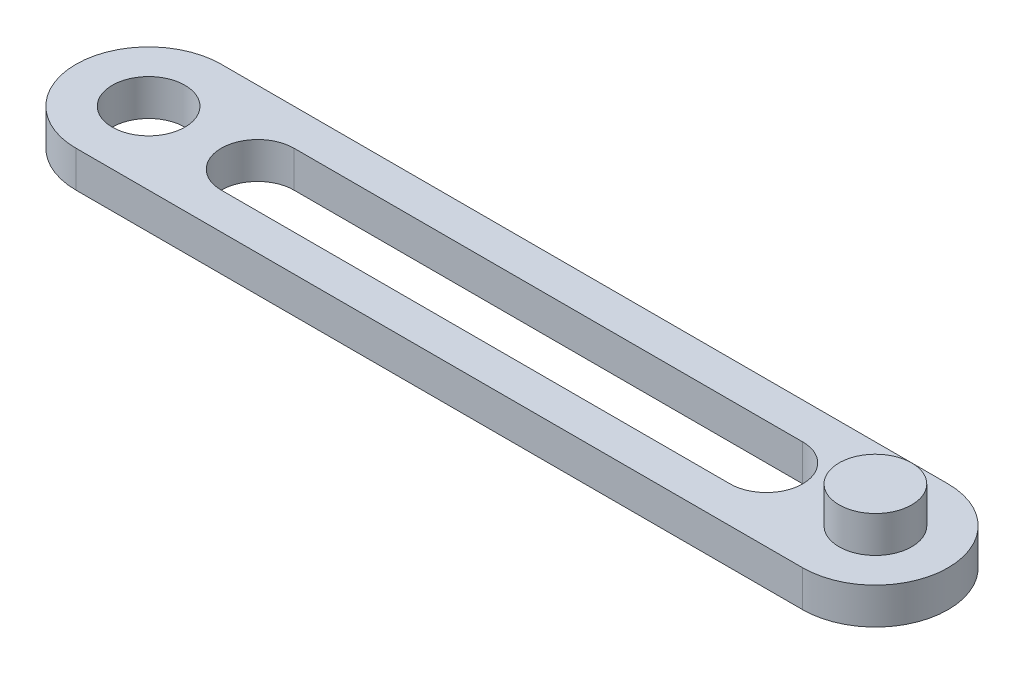
ISO-10303-21;
HEADER;
FILE_DESCRIPTION(('STEP AP214'),'2;1');
FILE_NAME('part.step','',(''),(''),'','','');
FILE_SCHEMA(('AUTOMOTIVE_DESIGN { 1 0 10303 214 1 1 1 1 }'));
ENDSEC;
DATA;
#1=APPLICATION_CONTEXT('core data for automotive mechanical design processes');
#2=APPLICATION_PROTOCOL_DEFINITION('international standard','automotive_design',2000,#1);
#3=PRODUCT_CONTEXT('',#1,'mechanical');
#4=PRODUCT('Part','Part','',(#3));
#5=PRODUCT_RELATED_PRODUCT_CATEGORY('part','',(#4));
#6=PRODUCT_DEFINITION_FORMATION('','',#4);
#7=PRODUCT_DEFINITION_CONTEXT('part definition',#1,'design');
#8=PRODUCT_DEFINITION('design','',#6,#7);
#9=PRODUCT_DEFINITION_SHAPE('','',#8);
#10=(LENGTH_UNIT() NAMED_UNIT(*) SI_UNIT(.MILLI.,.METRE.));
#11=(NAMED_UNIT(*) PLANE_ANGLE_UNIT() SI_UNIT($,.RADIAN.));
#12=(NAMED_UNIT(*) SI_UNIT($,.STERADIAN.) SOLID_ANGLE_UNIT());
#13=UNCERTAINTY_MEASURE_WITH_UNIT(LENGTH_MEASURE(1.E-05),#10,'distance_accuracy_value','');
#14=(GEOMETRIC_REPRESENTATION_CONTEXT(3) GLOBAL_UNCERTAINTY_ASSIGNED_CONTEXT((#13)) GLOBAL_UNIT_ASSIGNED_CONTEXT((#10,
#11,#12)) REPRESENTATION_CONTEXT('',''));
#15=CARTESIAN_POINT('',(0.,0.,0.));
#16=DIRECTION('',(0.,0.,1.));
#17=DIRECTION('',(1.,0.,0.));
#18=AXIS2_PLACEMENT_3D('',#15,#16,#17);
#19=CARTESIAN_POINT('',(-50.,5.,0.));
#20=DIRECTION('',(0.,-1.,0.));
#21=DIRECTION('',(0.,0.,-1.));
#22=AXIS2_PLACEMENT_3D('',#19,#20,#21);
#23=CYLINDRICAL_SURFACE('',#22,10.);
#24=CARTESIAN_POINT('',(-50.,0.,0.));
#25=DIRECTION('',(0.,1.,0.));
#26=DIRECTION('',(0.,0.,1.));
#27=AXIS2_PLACEMENT_3D('',#24,#25,#26);
#28=CIRCLE('',#27,10.);
#29=CARTESIAN_POINT('',(-50.,0.,-9.99999999999999));
#30=VERTEX_POINT('',#29);
#31=CARTESIAN_POINT('',(-50.,0.,10.));
#32=VERTEX_POINT('',#31);
#33=EDGE_CURVE('E140',#30,#32,#28,.T.);
#34=ORIENTED_EDGE('',*,*,#33,.T.);
#35=DIRECTION('',(0.,-1.,0.));
#36=VECTOR('',#35,1.);
#37=CARTESIAN_POINT('',(-50.,5.,10.));
#38=LINE('',#37,#36);
#39=CARTESIAN_POINT('',(-50.,5.,10.));
#40=VERTEX_POINT('',#39);
#41=EDGE_CURVE('E11',#40,#32,#38,.T.);
#42=ORIENTED_EDGE('',*,*,#41,.F.);
#43=CARTESIAN_POINT('',(-50.,5.,0.));
#44=DIRECTION('',(0.,1.,0.));
#45=DIRECTION('',(0.,0.,1.));
#46=AXIS2_PLACEMENT_3D('',#43,#44,#45);
#47=CIRCLE('',#46,10.);
#48=CARTESIAN_POINT('',(-50.,5.,-9.99999999999999));
#49=VERTEX_POINT('',#48);
#50=EDGE_CURVE('E144',#49,#40,#47,.T.);
#51=ORIENTED_EDGE('',*,*,#50,.F.);
#52=DIRECTION('',(0.,-1.,0.));
#53=VECTOR('',#52,1.);
#54=CARTESIAN_POINT('',(-50.,5.,-9.99999999999999));
#55=LINE('',#54,#53);
#56=EDGE_CURVE('E154',#49,#30,#55,.T.);
#57=ORIENTED_EDGE('',*,*,#56,.T.);
#58=EDGE_LOOP('',(#34,#42,#51,#57));
#59=FACE_BOUND('',#58,.T.);
#60=ADVANCED_FACE('F39',(#59),#23,.T.);
#61=CARTESIAN_POINT('',(-50.,5.,10.));
#62=DIRECTION('',(0.,0.,-1.));
#63=DIRECTION('',(-1.,0.,0.));
#64=AXIS2_PLACEMENT_3D('',#61,#62,#63);
#65=PLANE('',#64);
#66=DIRECTION('',(1.,0.,0.));
#67=VECTOR('',#66,1.);
#68=CARTESIAN_POINT('',(-50.,0.,10.));
#69=LINE('',#68,#67);
#70=CARTESIAN_POINT('',(50.,0.,10.));
#71=VERTEX_POINT('',#70);
#72=EDGE_CURVE('E157',#32,#71,#69,.T.);
#73=ORIENTED_EDGE('',*,*,#72,.T.);
#74=DIRECTION('',(0.,-1.,0.));
#75=VECTOR('',#74,1.);
#76=CARTESIAN_POINT('',(50.,5.,10.));
#77=LINE('',#76,#75);
#78=CARTESIAN_POINT('',(50.,5.,10.));
#79=VERTEX_POINT('',#78);
#80=EDGE_CURVE('E46',#79,#71,#77,.T.);
#81=ORIENTED_EDGE('',*,*,#80,.F.);
#82=DIRECTION('',(1.,0.,0.));
#83=VECTOR('',#82,1.);
#84=CARTESIAN_POINT('',(-50.,5.,10.));
#85=LINE('',#84,#83);
#86=EDGE_CURVE('E147',#40,#79,#85,.T.);
#87=ORIENTED_EDGE('',*,*,#86,.F.);
#88=ORIENTED_EDGE('',*,*,#41,.T.);
#89=EDGE_LOOP('',(#73,#81,#87,#88));
#90=FACE_BOUND('',#89,.T.);
#91=ADVANCED_FACE('F185',(#90),#65,.F.);
#92=CARTESIAN_POINT('',(50.,5.,0.));
#93=DIRECTION('',(0.,-1.,0.));
#94=DIRECTION('',(0.,0.,-1.));
#95=AXIS2_PLACEMENT_3D('',#92,#93,#94);
#96=CYLINDRICAL_SURFACE('',#95,10.);
#97=CARTESIAN_POINT('',(50.,0.,0.));
#98=DIRECTION('',(0.,1.,0.));
#99=DIRECTION('',(0.,0.,1.));
#100=AXIS2_PLACEMENT_3D('',#97,#98,#99);
#101=CIRCLE('',#100,10.);
#102=CARTESIAN_POINT('',(50.,0.,-10.));
#103=VERTEX_POINT('',#102);
#104=EDGE_CURVE('E159',#71,#103,#101,.T.);
#105=ORIENTED_EDGE('',*,*,#104,.T.);
#106=DIRECTION('',(0.,-1.,0.));
#107=VECTOR('',#106,1.);
#108=CARTESIAN_POINT('',(50.,5.,-10.));
#109=LINE('',#108,#107);
#110=CARTESIAN_POINT('',(50.,5.,-10.));
#111=VERTEX_POINT('',#110);
#112=EDGE_CURVE('E164',#111,#103,#109,.T.);
#113=ORIENTED_EDGE('',*,*,#112,.F.);
#114=CARTESIAN_POINT('',(50.,5.,0.));
#115=DIRECTION('',(0.,1.,0.));
#116=DIRECTION('',(0.,0.,1.));
#117=AXIS2_PLACEMENT_3D('',#114,#115,#116);
#118=CIRCLE('',#117,10.);
#119=EDGE_CURVE('E150',#79,#111,#118,.T.);
#120=ORIENTED_EDGE('',*,*,#119,.F.);
#121=ORIENTED_EDGE('',*,*,#80,.T.);
#122=EDGE_LOOP('',(#105,#113,#120,#121));
#123=FACE_BOUND('',#122,.T.);
#124=ADVANCED_FACE('F171',(#123),#96,.T.);
#125=CARTESIAN_POINT('',(-50.,5.,-9.99999999999999));
#126=DIRECTION('',(0.,0.,1.));
#127=DIRECTION('',(1.,0.,0.));
#128=AXIS2_PLACEMENT_3D('',#125,#126,#127);
#129=PLANE('',#128);
#130=DIRECTION('',(-1.,0.,0.));
#131=VECTOR('',#130,1.);
#132=CARTESIAN_POINT('',(-50.,0.,-9.99999999999999));
#133=LINE('',#132,#131);
#134=EDGE_CURVE('E148',#103,#30,#133,.T.);
#135=ORIENTED_EDGE('',*,*,#134,.T.);
#136=ORIENTED_EDGE('',*,*,#56,.F.);
#137=DIRECTION('',(-1.,0.,0.));
#138=VECTOR('',#137,1.);
#139=CARTESIAN_POINT('',(-50.,5.,-9.99999999999999));
#140=LINE('',#139,#138);
#141=EDGE_CURVE('E152',#111,#49,#140,.T.);
#142=ORIENTED_EDGE('',*,*,#141,.F.);
#143=ORIENTED_EDGE('',*,*,#112,.T.);
#144=EDGE_LOOP('',(#135,#136,#142,#143));
#145=FACE_BOUND('',#144,.T.);
#146=ADVANCED_FACE('F178',(#145),#129,.F.);
#147=CARTESIAN_POINT('',(-50.,5.,0.));
#148=DIRECTION('',(0.,1.,0.));
#149=DIRECTION('',(0.,0.,1.));
#150=AXIS2_PLACEMENT_3D('',#147,#148,#149);
#151=PLANE('',#150);
#152=CARTESIAN_POINT('',(-50.,5.,0.));
#153=DIRECTION('',(0.,1.,0.));
#154=DIRECTION('',(0.,0.,1.));
#155=AXIS2_PLACEMENT_3D('',#152,#153,#154);
#156=CIRCLE('',#155,5.);
#157=CARTESIAN_POINT('',(-50.,5.,5.));
#158=VERTEX_POINT('',#157);
#159=EDGE_CURVE('E231',#158,#158,#156,.T.);
#160=ORIENTED_EDGE('',*,*,#159,.F.);
#161=EDGE_LOOP('',(#160));
#162=FACE_BOUND('',#161,.T.);
#163=CARTESIAN_POINT('',(50.,5.,0.));
#164=DIRECTION('',(0.,1.,0.));
#165=DIRECTION('',(0.,0.,1.));
#166=AXIS2_PLACEMENT_3D('',#163,#164,#165);
#167=CIRCLE('',#166,5.);
#168=CARTESIAN_POINT('',(50.,5.,5.));
#169=VERTEX_POINT('',#168);
#170=EDGE_CURVE('E127',#169,#169,#167,.T.);
#171=ORIENTED_EDGE('',*,*,#170,.F.);
#172=EDGE_LOOP('',(#171));
#173=FACE_BOUND('',#172,.T.);
#174=CARTESIAN_POINT('',(-35.,5.,0.));
#175=DIRECTION('',(0.,1.,0.));
#176=DIRECTION('',(0.,0.,1.));
#177=AXIS2_PLACEMENT_3D('',#174,#175,#176);
#178=CIRCLE('',#177,5.);
#179=CARTESIAN_POINT('',(-35.,5.,-5.));
#180=VERTEX_POINT('',#179);
#181=CARTESIAN_POINT('',(-35.,5.,5.));
#182=VERTEX_POINT('',#181);
#183=EDGE_CURVE('E53',#180,#182,#178,.T.);
#184=ORIENTED_EDGE('',*,*,#183,.F.);
#185=DIRECTION('',(-1.,0.,0.));
#186=VECTOR('',#185,1.);
#187=CARTESIAN_POINT('',(-35.,5.,-5.));
#188=LINE('',#187,#186);
#189=CARTESIAN_POINT('',(35.,5.,-5.));
#190=VERTEX_POINT('',#189);
#191=EDGE_CURVE('E121',#190,#180,#188,.T.);
#192=ORIENTED_EDGE('',*,*,#191,.F.);
#193=CARTESIAN_POINT('',(35.,5.,0.));
#194=DIRECTION('',(0.,1.,0.));
#195=DIRECTION('',(0.,0.,1.));
#196=AXIS2_PLACEMENT_3D('',#193,#194,#195);
#197=CIRCLE('',#196,5.);
#198=CARTESIAN_POINT('',(35.,5.,5.));
#199=VERTEX_POINT('',#198);
#200=EDGE_CURVE('E124',#199,#190,#197,.T.);
#201=ORIENTED_EDGE('',*,*,#200,.F.);
#202=DIRECTION('',(1.,0.,0.));
#203=VECTOR('',#202,1.);
#204=CARTESIAN_POINT('',(-35.,5.,5.));
#205=LINE('',#204,#203);
#206=EDGE_CURVE('E133',#182,#199,#205,.T.);
#207=ORIENTED_EDGE('',*,*,#206,.F.);
#208=EDGE_LOOP('',(#184,#192,#201,#207));
#209=FACE_BOUND('',#208,.T.);
#210=ORIENTED_EDGE('',*,*,#50,.T.);
#211=ORIENTED_EDGE('',*,*,#86,.T.);
#212=ORIENTED_EDGE('',*,*,#119,.T.);
#213=ORIENTED_EDGE('',*,*,#141,.T.);
#214=EDGE_LOOP('',(#210,#211,#212,#213));
#215=FACE_BOUND('',#214,.T.);
#216=ADVANCED_FACE('F184',(#162,#173,#209,#215),#151,.T.);
#217=CARTESIAN_POINT('',(-50.,0.,0.));
#218=DIRECTION('',(0.,1.,0.));
#219=DIRECTION('',(0.,0.,1.));
#220=AXIS2_PLACEMENT_3D('',#217,#218,#219);
#221=PLANE('',#220);
#222=CARTESIAN_POINT('',(-50.,0.,0.));
#223=DIRECTION('',(0.,1.,0.));
#224=DIRECTION('',(0.,0.,1.));
#225=AXIS2_PLACEMENT_3D('',#222,#223,#224);
#226=CIRCLE('',#225,5.);
#227=CARTESIAN_POINT('',(-50.,0.,5.));
#228=VERTEX_POINT('',#227);
#229=EDGE_CURVE('E228',#228,#228,#226,.T.);
#230=ORIENTED_EDGE('',*,*,#229,.T.);
#231=EDGE_LOOP('',(#230));
#232=FACE_BOUND('',#231,.T.);
#233=DIRECTION('',(-1.,0.,0.));
#234=VECTOR('',#233,1.);
#235=CARTESIAN_POINT('',(-35.,0.,-5.));
#236=LINE('',#235,#234);
#237=CARTESIAN_POINT('',(35.,0.,-5.));
#238=VERTEX_POINT('',#237);
#239=CARTESIAN_POINT('',(-35.,0.,-5.));
#240=VERTEX_POINT('',#239);
#241=EDGE_CURVE('E111',#238,#240,#236,.T.);
#242=ORIENTED_EDGE('',*,*,#241,.T.);
#243=CARTESIAN_POINT('',(-35.,0.,0.));
#244=DIRECTION('',(0.,1.,0.));
#245=DIRECTION('',(0.,0.,1.));
#246=AXIS2_PLACEMENT_3D('',#243,#244,#245);
#247=CIRCLE('',#246,5.);
#248=CARTESIAN_POINT('',(-35.,0.,5.));
#249=VERTEX_POINT('',#248);
#250=EDGE_CURVE('E105',#240,#249,#247,.T.);
#251=ORIENTED_EDGE('',*,*,#250,.T.);
#252=DIRECTION('',(1.,0.,0.));
#253=VECTOR('',#252,1.);
#254=CARTESIAN_POINT('',(-35.,0.,5.));
#255=LINE('',#254,#253);
#256=CARTESIAN_POINT('',(35.,0.,5.));
#257=VERTEX_POINT('',#256);
#258=EDGE_CURVE('E114',#249,#257,#255,.T.);
#259=ORIENTED_EDGE('',*,*,#258,.T.);
#260=CARTESIAN_POINT('',(35.,0.,0.));
#261=DIRECTION('',(0.,1.,0.));
#262=DIRECTION('',(0.,0.,1.));
#263=AXIS2_PLACEMENT_3D('',#260,#261,#262);
#264=CIRCLE('',#263,5.);
#265=EDGE_CURVE('E61',#257,#238,#264,.T.);
#266=ORIENTED_EDGE('',*,*,#265,.T.);
#267=EDGE_LOOP('',(#242,#251,#259,#266));
#268=FACE_BOUND('',#267,.T.);
#269=ORIENTED_EDGE('',*,*,#33,.F.);
#270=ORIENTED_EDGE('',*,*,#134,.F.);
#271=ORIENTED_EDGE('',*,*,#104,.F.);
#272=ORIENTED_EDGE('',*,*,#72,.F.);
#273=EDGE_LOOP('',(#269,#270,#271,#272));
#274=FACE_BOUND('',#273,.T.);
#275=ADVANCED_FACE('F118',(#232,#268,#274),#221,.F.);
#276=CARTESIAN_POINT('',(-35.,0.,0.));
#277=DIRECTION('',(0.,1.,0.));
#278=DIRECTION('',(0.,0.,1.));
#279=AXIS2_PLACEMENT_3D('',#276,#277,#278);
#280=CYLINDRICAL_SURFACE('',#279,5.);
#281=ORIENTED_EDGE('',*,*,#183,.T.);
#282=DIRECTION('',(0.,1.,0.));
#283=VECTOR('',#282,1.);
#284=CARTESIAN_POINT('',(-35.,0.,5.));
#285=LINE('',#284,#283);
#286=EDGE_CURVE('E101',#249,#182,#285,.T.);
#287=ORIENTED_EDGE('',*,*,#286,.F.);
#288=ORIENTED_EDGE('',*,*,#250,.F.);
#289=DIRECTION('',(0.,1.,0.));
#290=VECTOR('',#289,1.);
#291=CARTESIAN_POINT('',(-35.,0.,-5.));
#292=LINE('',#291,#290);
#293=EDGE_CURVE('E138',#240,#180,#292,.T.);
#294=ORIENTED_EDGE('',*,*,#293,.T.);
#295=EDGE_LOOP('',(#281,#287,#288,#294));
#296=FACE_BOUND('',#295,.T.);
#297=ADVANCED_FACE('F103',(#296),#280,.F.);
#298=CARTESIAN_POINT('',(-35.,0.,-5.));
#299=DIRECTION('',(0.,0.,-1.));
#300=DIRECTION('',(-1.,0.,0.));
#301=AXIS2_PLACEMENT_3D('',#298,#299,#300);
#302=PLANE('',#301);
#303=ORIENTED_EDGE('',*,*,#191,.T.);
#304=ORIENTED_EDGE('',*,*,#293,.F.);
#305=ORIENTED_EDGE('',*,*,#241,.F.);
#306=DIRECTION('',(0.,1.,0.));
#307=VECTOR('',#306,1.);
#308=CARTESIAN_POINT('',(35.,0.,-5.));
#309=LINE('',#308,#307);
#310=EDGE_CURVE('E141',#238,#190,#309,.T.);
#311=ORIENTED_EDGE('',*,*,#310,.T.);
#312=EDGE_LOOP('',(#303,#304,#305,#311));
#313=FACE_BOUND('',#312,.T.);
#314=ADVANCED_FACE('F203',(#313),#302,.F.);
#315=CARTESIAN_POINT('',(35.,0.,0.));
#316=DIRECTION('',(0.,1.,0.));
#317=DIRECTION('',(0.,0.,1.));
#318=AXIS2_PLACEMENT_3D('',#315,#316,#317);
#319=CYLINDRICAL_SURFACE('',#318,5.);
#320=ORIENTED_EDGE('',*,*,#200,.T.);
#321=ORIENTED_EDGE('',*,*,#310,.F.);
#322=ORIENTED_EDGE('',*,*,#265,.F.);
#323=DIRECTION('',(0.,1.,0.));
#324=VECTOR('',#323,1.);
#325=CARTESIAN_POINT('',(35.,0.,5.));
#326=LINE('',#325,#324);
#327=EDGE_CURVE('E110',#257,#199,#326,.T.);
#328=ORIENTED_EDGE('',*,*,#327,.T.);
#329=EDGE_LOOP('',(#320,#321,#322,#328));
#330=FACE_BOUND('',#329,.T.);
#331=ADVANCED_FACE('F207',(#330),#319,.F.);
#332=CARTESIAN_POINT('',(-35.,0.,5.));
#333=DIRECTION('',(0.,0.,1.));
#334=DIRECTION('',(1.,0.,0.));
#335=AXIS2_PLACEMENT_3D('',#332,#333,#334);
#336=PLANE('',#335);
#337=ORIENTED_EDGE('',*,*,#206,.T.);
#338=ORIENTED_EDGE('',*,*,#327,.F.);
#339=ORIENTED_EDGE('',*,*,#258,.F.);
#340=ORIENTED_EDGE('',*,*,#286,.T.);
#341=EDGE_LOOP('',(#337,#338,#339,#340));
#342=FACE_BOUND('',#341,.T.);
#343=ADVANCED_FACE('F115',(#342),#336,.F.);
#344=CARTESIAN_POINT('',(50.,10.,0.));
#345=DIRECTION('',(0.,-1.,0.));
#346=DIRECTION('',(0.,0.,-1.));
#347=AXIS2_PLACEMENT_3D('',#344,#345,#346);
#348=CYLINDRICAL_SURFACE('',#347,5.);
#349=CARTESIAN_POINT('',(50.,10.,0.));
#350=DIRECTION('',(0.,1.,0.));
#351=DIRECTION('',(0.,0.,1.));
#352=AXIS2_PLACEMENT_3D('',#349,#350,#351);
#353=CIRCLE('',#352,5.);
#354=CARTESIAN_POINT('',(50.,10.,5.));
#355=VERTEX_POINT('',#354);
#356=EDGE_CURVE('E134',#355,#355,#353,.T.);
#357=ORIENTED_EDGE('',*,*,#356,.F.);
#358=EDGE_LOOP('',(#357));
#359=FACE_BOUND('',#358,.T.);
#360=ORIENTED_EDGE('',*,*,#170,.T.);
#361=EDGE_LOOP('',(#360));
#362=FACE_BOUND('',#361,.T.);
#363=ADVANCED_FACE('F206',(#359,#362),#348,.T.);
#364=CARTESIAN_POINT('',(50.,10.,0.));
#365=DIRECTION('',(0.,1.,0.));
#366=DIRECTION('',(0.,0.,1.));
#367=AXIS2_PLACEMENT_3D('',#364,#365,#366);
#368=PLANE('',#367);
#369=ORIENTED_EDGE('',*,*,#356,.T.);
#370=EDGE_LOOP('',(#369));
#371=FACE_BOUND('',#370,.T.);
#372=ADVANCED_FACE('F215',(#371),#368,.T.);
#373=CARTESIAN_POINT('',(-50.,0.,0.));
#374=DIRECTION('',(0.,1.,0.));
#375=DIRECTION('',(0.,0.,1.));
#376=AXIS2_PLACEMENT_3D('',#373,#374,#375);
#377=CYLINDRICAL_SURFACE('',#376,5.);
#378=ORIENTED_EDGE('',*,*,#229,.F.);
#379=EDGE_LOOP('',(#378));
#380=FACE_BOUND('',#379,.T.);
#381=ORIENTED_EDGE('',*,*,#159,.T.);
#382=EDGE_LOOP('',(#381));
#383=FACE_BOUND('',#382,.T.);
#384=ADVANCED_FACE('F219',(#380,#383),#377,.F.);
#385=CLOSED_SHELL('',(#60,#91,#124,#146,#216,#275,#297,#314,#331,#343,#363,#372,#384));
#386=MANIFOLD_SOLID_BREP('B2',#385);
#387=ADVANCED_BREP_SHAPE_REPRESENTATION('',(#18,#386),#14);
#388=SHAPE_DEFINITION_REPRESENTATION(#9,#387);
ENDSEC;
END-ISO-10303-21;
